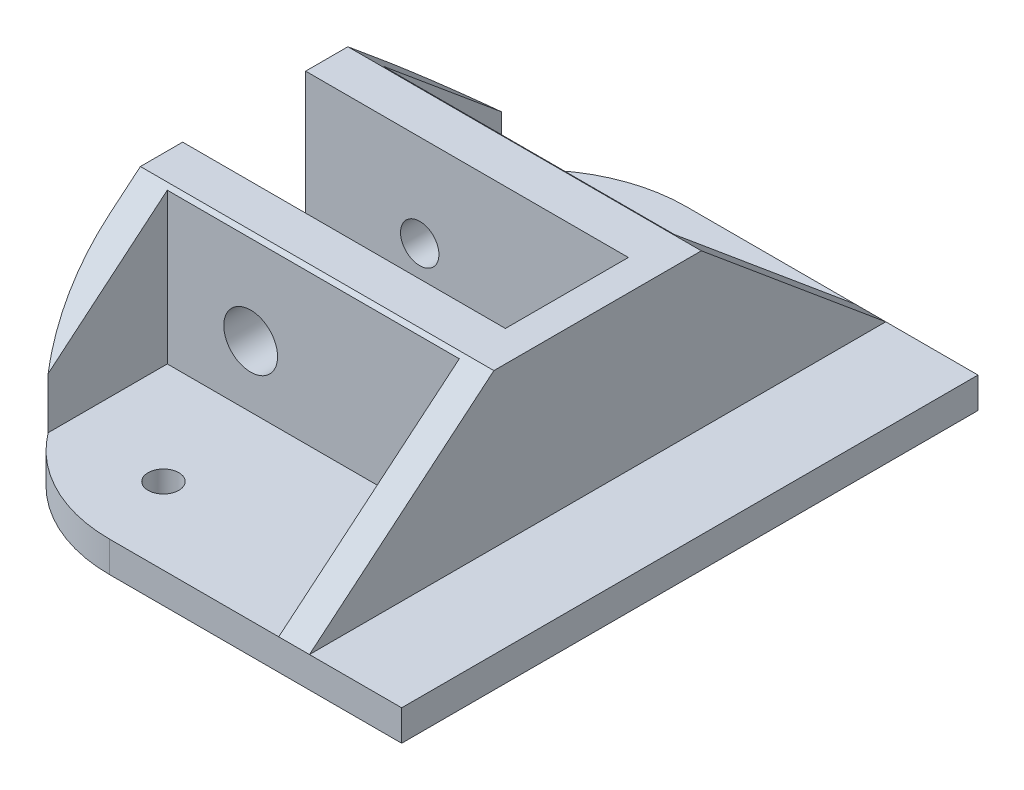
ISO-10303-21;
HEADER;
FILE_DESCRIPTION(('STEP AP214'),'2;1');
FILE_NAME('part.step','',(''),(''),'','','');
FILE_SCHEMA(('AUTOMOTIVE_DESIGN { 1 0 10303 214 1 1 1 1 }'));
ENDSEC;
DATA;
#1=APPLICATION_CONTEXT('core data for automotive mechanical design processes');
#2=APPLICATION_PROTOCOL_DEFINITION('international standard','automotive_design',2000,#1);
#3=PRODUCT_CONTEXT('',#1,'mechanical');
#4=PRODUCT('Part','Part','',(#3));
#5=PRODUCT_RELATED_PRODUCT_CATEGORY('part','',(#4));
#6=PRODUCT_DEFINITION_FORMATION('','',#4);
#7=PRODUCT_DEFINITION_CONTEXT('part definition',#1,'design');
#8=PRODUCT_DEFINITION('design','',#6,#7);
#9=PRODUCT_DEFINITION_SHAPE('','',#8);
#10=(LENGTH_UNIT() NAMED_UNIT(*) SI_UNIT(.MILLI.,.METRE.));
#11=(NAMED_UNIT(*) PLANE_ANGLE_UNIT() SI_UNIT($,.RADIAN.));
#12=(NAMED_UNIT(*) SI_UNIT($,.STERADIAN.) SOLID_ANGLE_UNIT());
#13=UNCERTAINTY_MEASURE_WITH_UNIT(LENGTH_MEASURE(1.E-05),#10,'distance_accuracy_value','');
#14=(GEOMETRIC_REPRESENTATION_CONTEXT(3) GLOBAL_UNCERTAINTY_ASSIGNED_CONTEXT((#13)) GLOBAL_UNIT_ASSIGNED_CONTEXT((#10,
#11,#12)) REPRESENTATION_CONTEXT('',''));
#15=CARTESIAN_POINT('',(0.,0.,0.));
#16=DIRECTION('',(0.,0.,1.));
#17=DIRECTION('',(1.,0.,0.));
#18=AXIS2_PLACEMENT_3D('',#15,#16,#17);
#19=CARTESIAN_POINT('',(0.,2.,0.));
#20=DIRECTION('',(0.,1.,0.));
#21=DIRECTION('',(0.,0.,1.));
#22=AXIS2_PLACEMENT_3D('',#19,#20,#21);
#23=PLANE('',#22);
#24=DIRECTION('',(-1.,0.,0.));
#25=VECTOR('',#24,1.);
#26=CARTESIAN_POINT('',(29.,2.,-37.5));
#27=LINE('',#26,#25);
#28=CARTESIAN_POINT('',(21.,2.,-37.5));
#29=VERTEX_POINT('',#28);
#30=CARTESIAN_POINT('',(10.,2.,-37.5));
#31=VERTEX_POINT('',#30);
#32=EDGE_CURVE('E263',#29,#31,#27,.T.);
#33=ORIENTED_EDGE('',*,*,#32,.T.);
#34=CARTESIAN_POINT('',(10.,2.,-27.5));
#35=DIRECTION('',(0.,1.,0.));
#36=DIRECTION('',(0.,0.,1.));
#37=AXIS2_PLACEMENT_3D('',#34,#35,#36);
#38=CIRCLE('',#37,10.);
#39=CARTESIAN_POINT('',(2.,2.,-33.5));
#40=VERTEX_POINT('',#39);
#41=EDGE_CURVE('E311',#31,#40,#38,.T.);
#42=ORIENTED_EDGE('',*,*,#41,.T.);
#43=DIRECTION('',(0.,0.,-1.));
#44=VECTOR('',#43,1.);
#45=CARTESIAN_POINT('',(2.,2.,-25.75));
#46=LINE('',#45,#44);
#47=CARTESIAN_POINT('',(2.,2.,-25.75));
#48=VERTEX_POINT('',#47);
#49=EDGE_CURVE('E188',#48,#40,#46,.T.);
#50=ORIENTED_EDGE('',*,*,#49,.F.);
#51=DIRECTION('',(-1.,0.,0.));
#52=VECTOR('',#51,1.);
#53=CARTESIAN_POINT('',(21.,2.,-25.75));
#54=LINE('',#53,#52);
#55=CARTESIAN_POINT('',(21.,2.,-25.75));
#56=VERTEX_POINT('',#55);
#57=EDGE_CURVE('E232',#56,#48,#54,.T.);
#58=ORIENTED_EDGE('',*,*,#57,.F.);
#59=DIRECTION('',(0.,0.,1.));
#60=VECTOR('',#59,1.);
#61=CARTESIAN_POINT('',(21.,2.,-37.5));
#62=LINE('',#61,#60);
#63=EDGE_CURVE('E229',#29,#56,#62,.T.);
#64=ORIENTED_EDGE('',*,*,#63,.F.);
#65=EDGE_LOOP('',(#33,#42,#50,#58,#64));
#66=FACE_BOUND('',#65,.T.);
#67=CARTESIAN_POINT('',(8.5,2.,-32.5));
#68=DIRECTION('',(0.,1.,0.));
#69=DIRECTION('',(0.,0.,1.));
#70=AXIS2_PLACEMENT_3D('',#67,#68,#69);
#71=CIRCLE('',#70,1.);
#72=CARTESIAN_POINT('',(8.5,2.,-31.5));
#73=VERTEX_POINT('',#72);
#74=EDGE_CURVE('E251',#73,#73,#71,.T.);
#75=ORIENTED_EDGE('',*,*,#74,.F.);
#76=EDGE_LOOP('',(#75));
#77=FACE_BOUND('',#76,.T.);
#78=ADVANCED_FACE('F38',(#66,#77),#23,.T.);
#79=DIRECTION('',(0.,0.,-1.));
#80=VECTOR('',#79,1.);
#81=CARTESIAN_POINT('',(23.,2.,0.));
#82=LINE('',#81,#80);
#83=CARTESIAN_POINT('',(23.,2.,0.));
#84=VERTEX_POINT('',#83);
#85=CARTESIAN_POINT('',(23.,2.,-37.5));
#86=VERTEX_POINT('',#85);
#87=EDGE_CURVE('E226',#84,#86,#82,.T.);
#88=ORIENTED_EDGE('',*,*,#87,.F.);
#89=DIRECTION('',(1.,0.,0.));
#90=VECTOR('',#89,1.);
#91=CARTESIAN_POINT('',(0.,2.,0.));
#92=LINE('',#91,#90);
#93=CARTESIAN_POINT('',(29.,2.,0.));
#94=VERTEX_POINT('',#93);
#95=EDGE_CURVE('E257',#84,#94,#92,.T.);
#96=ORIENTED_EDGE('',*,*,#95,.T.);
#97=DIRECTION('',(0.,0.,-1.));
#98=VECTOR('',#97,1.);
#99=CARTESIAN_POINT('',(29.,2.,0.));
#100=LINE('',#99,#98);
#101=CARTESIAN_POINT('',(29.,2.,-37.5));
#102=VERTEX_POINT('',#101);
#103=EDGE_CURVE('E261',#94,#102,#100,.T.);
#104=ORIENTED_EDGE('',*,*,#103,.T.);
#105=EDGE_CURVE('E264',#102,#86,#27,.T.);
#106=ORIENTED_EDGE('',*,*,#105,.T.);
#107=EDGE_LOOP('',(#88,#96,#104,#106));
#108=FACE_BOUND('',#107,.T.);
#109=ADVANCED_FACE('F389',(#108),#23,.T.);
#110=DIRECTION('',(0.,0.,-1.));
#111=VECTOR('',#110,1.);
#112=CARTESIAN_POINT('',(2.,2.,0.));
#113=LINE('',#112,#111);
#114=CARTESIAN_POINT('',(2.,2.,-4.));
#115=VERTEX_POINT('',#114);
#116=CARTESIAN_POINT('',(2.,2.,-11.75));
#117=VERTEX_POINT('',#116);
#118=EDGE_CURVE('E216',#115,#117,#113,.T.);
#119=ORIENTED_EDGE('',*,*,#118,.F.);
#120=CARTESIAN_POINT('',(10.,2.,-10.));
#121=DIRECTION('',(0.,1.,0.));
#122=DIRECTION('',(0.,0.,1.));
#123=AXIS2_PLACEMENT_3D('',#120,#121,#122);
#124=CIRCLE('',#123,10.);
#125=CARTESIAN_POINT('',(10.,2.,0.));
#126=VERTEX_POINT('',#125);
#127=EDGE_CURVE('E305',#115,#126,#124,.T.);
#128=ORIENTED_EDGE('',*,*,#127,.T.);
#129=CARTESIAN_POINT('',(21.,2.,0.));
#130=VERTEX_POINT('',#129);
#131=EDGE_CURVE('E259',#126,#130,#92,.T.);
#132=ORIENTED_EDGE('',*,*,#131,.T.);
#133=DIRECTION('',(0.,0.,1.));
#134=VECTOR('',#133,1.);
#135=CARTESIAN_POINT('',(21.,2.,-11.75));
#136=LINE('',#135,#134);
#137=CARTESIAN_POINT('',(21.,2.,-11.75));
#138=VERTEX_POINT('',#137);
#139=EDGE_CURVE('E223',#138,#130,#136,.T.);
#140=ORIENTED_EDGE('',*,*,#139,.F.);
#141=DIRECTION('',(1.,0.,0.));
#142=VECTOR('',#141,1.);
#143=CARTESIAN_POINT('',(2.,2.,-11.75));
#144=LINE('',#143,#142);
#145=EDGE_CURVE('E219',#117,#138,#144,.T.);
#146=ORIENTED_EDGE('',*,*,#145,.F.);
#147=EDGE_LOOP('',(#119,#128,#132,#140,#146));
#148=FACE_BOUND('',#147,.T.);
#149=CARTESIAN_POINT('',(8.5,2.,-5.));
#150=DIRECTION('',(0.,1.,0.));
#151=DIRECTION('',(0.,0.,1.));
#152=AXIS2_PLACEMENT_3D('',#149,#150,#151);
#153=CIRCLE('',#152,1.);
#154=CARTESIAN_POINT('',(8.5,2.,-4.));
#155=VERTEX_POINT('',#154);
#156=EDGE_CURVE('E245',#155,#155,#153,.T.);
#157=ORIENTED_EDGE('',*,*,#156,.F.);
#158=EDGE_LOOP('',(#157));
#159=FACE_BOUND('',#158,.T.);
#160=ADVANCED_FACE('F380',(#148,#159),#23,.T.);
#161=CARTESIAN_POINT('',(0.,0.,0.));
#162=DIRECTION('',(0.,1.,0.));
#163=DIRECTION('',(0.,0.,1.));
#164=AXIS2_PLACEMENT_3D('',#161,#162,#163);
#165=PLANE('',#164);
#166=DIRECTION('',(1.,0.,0.));
#167=VECTOR('',#166,1.);
#168=CARTESIAN_POINT('',(0.,0.,0.));
#169=LINE('',#168,#167);
#170=CARTESIAN_POINT('',(10.,0.,0.));
#171=VERTEX_POINT('',#170);
#172=CARTESIAN_POINT('',(29.,0.,0.));
#173=VERTEX_POINT('',#172);
#174=EDGE_CURVE('E270',#171,#173,#169,.T.);
#175=ORIENTED_EDGE('',*,*,#174,.F.);
#176=CARTESIAN_POINT('',(10.,0.,-10.));
#177=DIRECTION('',(0.,1.,0.));
#178=DIRECTION('',(0.,0.,1.));
#179=AXIS2_PLACEMENT_3D('',#176,#177,#178);
#180=CIRCLE('',#179,10.);
#181=CARTESIAN_POINT('',(0.,0.,-10.));
#182=VERTEX_POINT('',#181);
#183=EDGE_CURVE('E299',#171,#182,#180,.F.);
#184=ORIENTED_EDGE('',*,*,#183,.T.);
#185=DIRECTION('',(0.,0.,1.));
#186=VECTOR('',#185,1.);
#187=CARTESIAN_POINT('',(0.,0.,-14.75));
#188=LINE('',#187,#186);
#189=CARTESIAN_POINT('',(0.,0.,-14.75));
#190=VERTEX_POINT('',#189);
#191=EDGE_CURVE('E254',#190,#182,#188,.T.);
#192=ORIENTED_EDGE('',*,*,#191,.F.);
#193=DIRECTION('',(-1.,0.,0.));
#194=VECTOR('',#193,1.);
#195=CARTESIAN_POINT('',(21.,0.,-14.75));
#196=LINE('',#195,#194);
#197=CARTESIAN_POINT('',(21.,0.,-14.75));
#198=VERTEX_POINT('',#197);
#199=EDGE_CURVE('E260',#198,#190,#196,.T.);
#200=ORIENTED_EDGE('',*,*,#199,.F.);
#201=DIRECTION('',(0.,0.,1.));
#202=VECTOR('',#201,1.);
#203=CARTESIAN_POINT('',(21.,0.,-22.75));
#204=LINE('',#203,#202);
#205=CARTESIAN_POINT('',(21.,0.,-22.75));
#206=VERTEX_POINT('',#205);
#207=EDGE_CURVE('E280',#206,#198,#204,.T.);
#208=ORIENTED_EDGE('',*,*,#207,.F.);
#209=DIRECTION('',(1.,0.,0.));
#210=VECTOR('',#209,1.);
#211=CARTESIAN_POINT('',(0.,0.,-22.75));
#212=LINE('',#211,#210);
#213=CARTESIAN_POINT('',(0.,0.,-22.75));
#214=VERTEX_POINT('',#213);
#215=EDGE_CURVE('E278',#214,#206,#212,.T.);
#216=ORIENTED_EDGE('',*,*,#215,.F.);
#217=DIRECTION('',(0.,0.,1.));
#218=VECTOR('',#217,1.);
#219=CARTESIAN_POINT('',(0.,0.,-37.5));
#220=LINE('',#219,#218);
#221=CARTESIAN_POINT('',(0.,0.,-27.5));
#222=VERTEX_POINT('',#221);
#223=EDGE_CURVE('E194',#222,#214,#220,.T.);
#224=ORIENTED_EDGE('',*,*,#223,.F.);
#225=CARTESIAN_POINT('',(10.,0.,-27.5));
#226=DIRECTION('',(0.,1.,0.));
#227=DIRECTION('',(0.,0.,1.));
#228=AXIS2_PLACEMENT_3D('',#225,#226,#227);
#229=CIRCLE('',#228,10.);
#230=CARTESIAN_POINT('',(10.,0.,-37.5));
#231=VERTEX_POINT('',#230);
#232=EDGE_CURVE('E297',#222,#231,#229,.F.);
#233=ORIENTED_EDGE('',*,*,#232,.T.);
#234=DIRECTION('',(-1.,0.,0.));
#235=VECTOR('',#234,1.);
#236=CARTESIAN_POINT('',(29.,0.,-37.5));
#237=LINE('',#236,#235);
#238=CARTESIAN_POINT('',(29.,0.,-37.5));
#239=VERTEX_POINT('',#238);
#240=EDGE_CURVE('E274',#239,#231,#237,.T.);
#241=ORIENTED_EDGE('',*,*,#240,.F.);
#242=DIRECTION('',(0.,0.,-1.));
#243=VECTOR('',#242,1.);
#244=CARTESIAN_POINT('',(29.,0.,0.));
#245=LINE('',#244,#243);
#246=EDGE_CURVE('E272',#173,#239,#245,.T.);
#247=ORIENTED_EDGE('',*,*,#246,.F.);
#248=EDGE_LOOP('',(#175,#184,#192,#200,#208,#216,#224,#233,#241,#247));
#249=FACE_BOUND('',#248,.T.);
#250=CARTESIAN_POINT('',(8.5,0.,-32.5));
#251=DIRECTION('',(0.,1.,0.));
#252=DIRECTION('',(0.,0.,1.));
#253=AXIS2_PLACEMENT_3D('',#250,#251,#252);
#254=CIRCLE('',#253,1.);
#255=CARTESIAN_POINT('',(8.5,0.,-31.5));
#256=VERTEX_POINT('',#255);
#257=EDGE_CURVE('E248',#256,#256,#254,.T.);
#258=ORIENTED_EDGE('',*,*,#257,.T.);
#259=EDGE_LOOP('',(#258));
#260=FACE_BOUND('',#259,.T.);
#261=CARTESIAN_POINT('',(8.5,0.,-5.));
#262=DIRECTION('',(0.,1.,0.));
#263=DIRECTION('',(0.,0.,1.));
#264=AXIS2_PLACEMENT_3D('',#261,#262,#263);
#265=CIRCLE('',#264,1.);
#266=CARTESIAN_POINT('',(8.5,0.,-4.));
#267=VERTEX_POINT('',#266);
#268=EDGE_CURVE('E244',#267,#267,#265,.T.);
#269=ORIENTED_EDGE('',*,*,#268,.T.);
#270=EDGE_LOOP('',(#269));
#271=FACE_BOUND('',#270,.T.);
#272=ADVANCED_FACE('F364',(#249,#260,#271),#165,.F.);
#273=CARTESIAN_POINT('',(0.,2.,-14.75));
#274=DIRECTION('',(1.,0.,0.));
#275=DIRECTION('',(0.,0.,-1.));
#276=AXIS2_PLACEMENT_3D('',#273,#274,#275);
#277=PLANE('',#276);
#278=DIRECTION('',(0.,-1.,0.));
#279=VECTOR('',#278,1.);
#280=CARTESIAN_POINT('',(0.,2.,-10.));
#281=LINE('',#280,#279);
#282=CARTESIAN_POINT('',(0.,10.3333333333333,-10.));
#283=VERTEX_POINT('',#282);
#284=EDGE_CURVE('E301',#182,#283,#281,.F.);
#285=ORIENTED_EDGE('',*,*,#284,.T.);
#286=DIRECTION('',(0.,0.640184399664479,-0.768221279597376));
#287=VECTOR('',#286,1.);
#288=CARTESIAN_POINT('',(0.,12.,-12.0000000000001));
#289=LINE('',#288,#287);
#290=CARTESIAN_POINT('',(0.,12.,-12.0000000000001));
#291=VERTEX_POINT('',#290);
#292=EDGE_CURVE('E11',#283,#291,#289,.T.);
#293=ORIENTED_EDGE('',*,*,#292,.T.);
#294=DIRECTION('',(0.,0.,1.));
#295=VECTOR('',#294,1.);
#296=CARTESIAN_POINT('',(0.,12.,-14.75));
#297=LINE('',#296,#295);
#298=CARTESIAN_POINT('',(0.,12.,-14.75));
#299=VERTEX_POINT('',#298);
#300=EDGE_CURVE('E210',#299,#291,#297,.T.);
#301=ORIENTED_EDGE('',*,*,#300,.F.);
#302=DIRECTION('',(0.,-1.,0.));
#303=VECTOR('',#302,1.);
#304=CARTESIAN_POINT('',(0.,2.,-14.75));
#305=LINE('',#304,#303);
#306=EDGE_CURVE('E267',#299,#190,#305,.T.);
#307=ORIENTED_EDGE('',*,*,#306,.T.);
#308=ORIENTED_EDGE('',*,*,#191,.T.);
#309=EDGE_LOOP('',(#285,#293,#301,#307,#308));
#310=FACE_BOUND('',#309,.T.);
#311=ADVANCED_FACE('F355',(#310),#277,.F.);
#312=CARTESIAN_POINT('',(0.,2.,0.));
#313=DIRECTION('',(0.,0.,-1.));
#314=DIRECTION('',(-1.,0.,0.));
#315=AXIS2_PLACEMENT_3D('',#312,#313,#314);
#316=PLANE('',#315);
#317=ORIENTED_EDGE('',*,*,#95,.F.);
#318=DIRECTION('',(-1.,0.,0.));
#319=VECTOR('',#318,1.);
#320=CARTESIAN_POINT('',(21.,1.99999999999997,0.));
#321=LINE('',#320,#319);
#322=EDGE_CURVE('E336',#84,#130,#321,.T.);
#323=ORIENTED_EDGE('',*,*,#322,.T.);
#324=ORIENTED_EDGE('',*,*,#131,.F.);
#325=DIRECTION('',(0.,-1.,0.));
#326=VECTOR('',#325,1.);
#327=CARTESIAN_POINT('',(10.,2.,0.));
#328=LINE('',#327,#326);
#329=EDGE_CURVE('E294',#126,#171,#328,.T.);
#330=ORIENTED_EDGE('',*,*,#329,.T.);
#331=ORIENTED_EDGE('',*,*,#174,.T.);
#332=DIRECTION('',(0.,-1.,0.));
#333=VECTOR('',#332,1.);
#334=CARTESIAN_POINT('',(29.,2.,0.));
#335=LINE('',#334,#333);
#336=EDGE_CURVE('E291',#94,#173,#335,.T.);
#337=ORIENTED_EDGE('',*,*,#336,.F.);
#338=EDGE_LOOP('',(#317,#323,#324,#330,#331,#337));
#339=FACE_BOUND('',#338,.T.);
#340=ADVANCED_FACE('F374',(#339),#316,.F.);
#341=CARTESIAN_POINT('',(29.,2.,0.));
#342=DIRECTION('',(-1.,0.,0.));
#343=DIRECTION('',(0.,0.,1.));
#344=AXIS2_PLACEMENT_3D('',#341,#342,#343);
#345=PLANE('',#344);
#346=ORIENTED_EDGE('',*,*,#246,.T.);
#347=DIRECTION('',(0.,-1.,0.));
#348=VECTOR('',#347,1.);
#349=CARTESIAN_POINT('',(29.,2.,-37.5));
#350=LINE('',#349,#348);
#351=EDGE_CURVE('E197',#102,#239,#350,.T.);
#352=ORIENTED_EDGE('',*,*,#351,.F.);
#353=ORIENTED_EDGE('',*,*,#103,.F.);
#354=ORIENTED_EDGE('',*,*,#336,.T.);
#355=EDGE_LOOP('',(#346,#352,#353,#354));
#356=FACE_BOUND('',#355,.T.);
#357=ADVANCED_FACE('F394',(#356),#345,.F.);
#358=CARTESIAN_POINT('',(29.,2.,-37.5));
#359=DIRECTION('',(0.,0.,1.));
#360=DIRECTION('',(1.,0.,0.));
#361=AXIS2_PLACEMENT_3D('',#358,#359,#360);
#362=PLANE('',#361);
#363=ORIENTED_EDGE('',*,*,#32,.F.);
#364=DIRECTION('',(1.,0.,0.));
#365=VECTOR('',#364,1.);
#366=CARTESIAN_POINT('',(23.,1.99999999999998,-37.5));
#367=LINE('',#366,#365);
#368=EDGE_CURVE('E330',#29,#86,#367,.T.);
#369=ORIENTED_EDGE('',*,*,#368,.T.);
#370=ORIENTED_EDGE('',*,*,#105,.F.);
#371=ORIENTED_EDGE('',*,*,#351,.T.);
#372=ORIENTED_EDGE('',*,*,#240,.T.);
#373=DIRECTION('',(0.,-1.,0.));
#374=VECTOR('',#373,1.);
#375=CARTESIAN_POINT('',(10.,2.,-37.5));
#376=LINE('',#375,#374);
#377=EDGE_CURVE('E309',#231,#31,#376,.F.);
#378=ORIENTED_EDGE('',*,*,#377,.T.);
#379=EDGE_LOOP('',(#363,#369,#370,#371,#372,#378));
#380=FACE_BOUND('',#379,.T.);
#381=ADVANCED_FACE('F398',(#380),#362,.F.);
#382=CARTESIAN_POINT('',(0.,2.,-37.5));
#383=DIRECTION('',(1.,0.,0.));
#384=DIRECTION('',(0.,0.,-1.));
#385=AXIS2_PLACEMENT_3D('',#382,#383,#384);
#386=PLANE('',#385);
#387=DIRECTION('',(0.,0.,1.));
#388=VECTOR('',#387,1.);
#389=CARTESIAN_POINT('',(0.,12.,-37.5));
#390=LINE('',#389,#388);
#391=CARTESIAN_POINT('',(0.,12.,-25.5));
#392=VERTEX_POINT('',#391);
#393=CARTESIAN_POINT('',(0.,12.,-22.75));
#394=VERTEX_POINT('',#393);
#395=EDGE_CURVE('E177',#392,#394,#390,.T.);
#396=ORIENTED_EDGE('',*,*,#395,.F.);
#397=DIRECTION('',(0.,-0.640184399664479,-0.768221279597376));
#398=VECTOR('',#397,1.);
#399=CARTESIAN_POINT('',(0.,12.,-25.5));
#400=LINE('',#399,#398);
#401=CARTESIAN_POINT('',(0.,10.3333333333333,-27.5));
#402=VERTEX_POINT('',#401);
#403=EDGE_CURVE('E320',#392,#402,#400,.T.);
#404=ORIENTED_EDGE('',*,*,#403,.T.);
#405=DIRECTION('',(0.,-1.,0.));
#406=VECTOR('',#405,1.);
#407=CARTESIAN_POINT('',(0.,2.,-27.5));
#408=LINE('',#407,#406);
#409=EDGE_CURVE('E307',#402,#222,#408,.T.);
#410=ORIENTED_EDGE('',*,*,#409,.T.);
#411=ORIENTED_EDGE('',*,*,#223,.T.);
#412=DIRECTION('',(0.,-1.,0.));
#413=VECTOR('',#412,1.);
#414=CARTESIAN_POINT('',(0.,2.,-22.75));
#415=LINE('',#414,#413);
#416=EDGE_CURVE('E191',#394,#214,#415,.T.);
#417=ORIENTED_EDGE('',*,*,#416,.F.);
#418=EDGE_LOOP('',(#396,#404,#410,#411,#417));
#419=FACE_BOUND('',#418,.T.);
#420=ADVANCED_FACE('F192',(#419),#386,.F.);
#421=CARTESIAN_POINT('',(0.,2.,-22.75));
#422=DIRECTION('',(0.,0.,-1.));
#423=DIRECTION('',(-1.,0.,0.));
#424=AXIS2_PLACEMENT_3D('',#421,#422,#423);
#425=PLANE('',#424);
#426=CARTESIAN_POINT('',(7.425,6.,-22.75));
#427=DIRECTION('',(0.,0.,-1.));
#428=DIRECTION('',(-1.,0.,0.));
#429=AXIS2_PLACEMENT_3D('',#426,#427,#428);
#430=CIRCLE('',#429,1.25);
#431=CARTESIAN_POINT('',(6.17500000000001,6.,-22.75));
#432=VERTEX_POINT('',#431);
#433=EDGE_CURVE('E755',#432,#432,#430,.F.);
#434=ORIENTED_EDGE('',*,*,#433,.F.);
#435=EDGE_LOOP('',(#434));
#436=FACE_BOUND('',#435,.T.);
#437=ORIENTED_EDGE('',*,*,#215,.T.);
#438=DIRECTION('',(0.,-1.,0.));
#439=VECTOR('',#438,1.);
#440=CARTESIAN_POINT('',(21.,2.,-22.75));
#441=LINE('',#440,#439);
#442=CARTESIAN_POINT('',(21.,12.,-22.75));
#443=VERTEX_POINT('',#442);
#444=EDGE_CURVE('E198',#443,#206,#441,.T.);
#445=ORIENTED_EDGE('',*,*,#444,.F.);
#446=DIRECTION('',(1.,0.,0.));
#447=VECTOR('',#446,1.);
#448=CARTESIAN_POINT('',(0.,12.,-22.75));
#449=LINE('',#448,#447);
#450=EDGE_CURVE('E183',#394,#443,#449,.T.);
#451=ORIENTED_EDGE('',*,*,#450,.F.);
#452=ORIENTED_EDGE('',*,*,#416,.T.);
#453=EDGE_LOOP('',(#437,#445,#451,#452));
#454=FACE_BOUND('',#453,.T.);
#455=ADVANCED_FACE('F200',(#436,#454),#425,.F.);
#456=CARTESIAN_POINT('',(21.,2.,-22.75));
#457=DIRECTION('',(1.,0.,0.));
#458=DIRECTION('',(0.,0.,-1.));
#459=AXIS2_PLACEMENT_3D('',#456,#457,#458);
#460=PLANE('',#459);
#461=ORIENTED_EDGE('',*,*,#207,.T.);
#462=DIRECTION('',(0.,-1.,0.));
#463=VECTOR('',#462,1.);
#464=CARTESIAN_POINT('',(21.,2.,-14.75));
#465=LINE('',#464,#463);
#466=CARTESIAN_POINT('',(21.,12.,-14.75));
#467=VERTEX_POINT('',#466);
#468=EDGE_CURVE('E285',#467,#198,#465,.T.);
#469=ORIENTED_EDGE('',*,*,#468,.F.);
#470=DIRECTION('',(0.,0.,1.));
#471=VECTOR('',#470,1.);
#472=CARTESIAN_POINT('',(21.,12.,-22.75));
#473=LINE('',#472,#471);
#474=EDGE_CURVE('E202',#443,#467,#473,.T.);
#475=ORIENTED_EDGE('',*,*,#474,.F.);
#476=ORIENTED_EDGE('',*,*,#444,.T.);
#477=EDGE_LOOP('',(#461,#469,#475,#476));
#478=FACE_BOUND('',#477,.T.);
#479=ADVANCED_FACE('F415',(#478),#460,.F.);
#480=CARTESIAN_POINT('',(21.,2.,-14.75));
#481=DIRECTION('',(0.,0.,1.));
#482=DIRECTION('',(1.,0.,0.));
#483=AXIS2_PLACEMENT_3D('',#480,#481,#482);
#484=PLANE('',#483);
#485=CARTESIAN_POINT('',(7.42500000000001,6.,-14.75));
#486=DIRECTION('',(0.,0.,1.));
#487=DIRECTION('',(1.,0.,0.));
#488=AXIS2_PLACEMENT_3D('',#485,#486,#487);
#489=CIRCLE('',#488,1.75);
#490=CARTESIAN_POINT('',(9.17500000000001,6.,-14.75));
#491=VERTEX_POINT('',#490);
#492=EDGE_CURVE('E220',#491,#491,#489,.F.);
#493=ORIENTED_EDGE('',*,*,#492,.F.);
#494=EDGE_LOOP('',(#493));
#495=FACE_BOUND('',#494,.T.);
#496=ORIENTED_EDGE('',*,*,#199,.T.);
#497=ORIENTED_EDGE('',*,*,#306,.F.);
#498=DIRECTION('',(-1.,0.,0.));
#499=VECTOR('',#498,1.);
#500=CARTESIAN_POINT('',(21.,12.,-14.75));
#501=LINE('',#500,#499);
#502=EDGE_CURVE('E204',#467,#299,#501,.T.);
#503=ORIENTED_EDGE('',*,*,#502,.F.);
#504=ORIENTED_EDGE('',*,*,#468,.T.);
#505=EDGE_LOOP('',(#496,#497,#503,#504));
#506=FACE_BOUND('',#505,.T.);
#507=ADVANCED_FACE('F359',(#495,#506),#484,.F.);
#508=CARTESIAN_POINT('',(8.5,2.,-32.5));
#509=DIRECTION('',(0.,-1.,0.));
#510=DIRECTION('',(0.,0.,-1.));
#511=AXIS2_PLACEMENT_3D('',#508,#509,#510);
#512=CYLINDRICAL_SURFACE('',#511,1.);
#513=ORIENTED_EDGE('',*,*,#74,.T.);
#514=EDGE_LOOP('',(#513));
#515=FACE_BOUND('',#514,.T.);
#516=ORIENTED_EDGE('',*,*,#257,.F.);
#517=EDGE_LOOP('',(#516));
#518=FACE_BOUND('',#517,.T.);
#519=ADVANCED_FACE('F422',(#515,#518),#512,.F.);
#520=CARTESIAN_POINT('',(8.5,2.,-5.));
#521=DIRECTION('',(0.,-1.,0.));
#522=DIRECTION('',(0.,0.,-1.));
#523=AXIS2_PLACEMENT_3D('',#520,#521,#522);
#524=CYLINDRICAL_SURFACE('',#523,1.);
#525=ORIENTED_EDGE('',*,*,#156,.T.);
#526=EDGE_LOOP('',(#525));
#527=FACE_BOUND('',#526,.T.);
#528=ORIENTED_EDGE('',*,*,#268,.F.);
#529=EDGE_LOOP('',(#528));
#530=FACE_BOUND('',#529,.T.);
#531=ADVANCED_FACE('F567',(#527,#530),#524,.F.);
#532=CARTESIAN_POINT('',(2.,12.,0.));
#533=DIRECTION('',(-1.,0.,0.));
#534=DIRECTION('',(0.,0.,1.));
#535=AXIS2_PLACEMENT_3D('',#532,#533,#534);
#536=PLANE('',#535);
#537=DIRECTION('',(0.,-1.,0.));
#538=VECTOR('',#537,1.);
#539=CARTESIAN_POINT('',(2.,12.,-11.75));
#540=LINE('',#539,#538);
#541=CARTESIAN_POINT('',(2.,11.7916666666666,-11.75));
#542=VERTEX_POINT('',#541);
#543=EDGE_CURVE('E242',#542,#117,#540,.T.);
#544=ORIENTED_EDGE('',*,*,#543,.F.);
#545=DIRECTION('',(0.,-0.640184399664479,0.768221279597376));
#546=VECTOR('',#545,1.);
#547=CARTESIAN_POINT('',(2.,12.,-12.0000000000001));
#548=LINE('',#547,#546);
#549=CARTESIAN_POINT('',(2.,5.3333333333333,-4.));
#550=VERTEX_POINT('',#549);
#551=EDGE_CURVE('E61',#542,#550,#548,.T.);
#552=ORIENTED_EDGE('',*,*,#551,.T.);
#553=DIRECTION('',(0.,-1.,0.));
#554=VECTOR('',#553,1.);
#555=CARTESIAN_POINT('',(2.,12.,-4.));
#556=LINE('',#555,#554);
#557=EDGE_CURVE('E303',#550,#115,#556,.T.);
#558=ORIENTED_EDGE('',*,*,#557,.T.);
#559=ORIENTED_EDGE('',*,*,#118,.T.);
#560=EDGE_LOOP('',(#544,#552,#558,#559));
#561=FACE_BOUND('',#560,.T.);
#562=ADVANCED_FACE('F348',(#561),#536,.F.);
#563=CARTESIAN_POINT('',(2.,12.,-11.75));
#564=DIRECTION('',(0.,0.,-1.));
#565=DIRECTION('',(-1.,0.,0.));
#566=AXIS2_PLACEMENT_3D('',#563,#564,#565);
#567=PLANE('',#566);
#568=CARTESIAN_POINT('',(7.42500000000001,6.,-11.75));
#569=DIRECTION('',(0.,0.,1.));
#570=DIRECTION('',(1.,0.,0.));
#571=AXIS2_PLACEMENT_3D('',#568,#569,#570);
#572=CIRCLE('',#571,1.75);
#573=CARTESIAN_POINT('',(9.17500000000001,6.,-11.75));
#574=VERTEX_POINT('',#573);
#575=EDGE_CURVE('E751',#574,#574,#572,.T.);
#576=ORIENTED_EDGE('',*,*,#575,.F.);
#577=EDGE_LOOP('',(#576));
#578=FACE_BOUND('',#577,.T.);
#579=DIRECTION('',(0.,-1.,0.));
#580=VECTOR('',#579,1.);
#581=CARTESIAN_POINT('',(21.,12.,-11.75));
#582=LINE('',#581,#580);
#583=CARTESIAN_POINT('',(21.,11.7916666666666,-11.75));
#584=VERTEX_POINT('',#583);
#585=EDGE_CURVE('E240',#584,#138,#582,.T.);
#586=ORIENTED_EDGE('',*,*,#585,.F.);
#587=DIRECTION('',(-1.,0.,0.));
#588=VECTOR('',#587,1.);
#589=CARTESIAN_POINT('',(0.,11.7916666666666,-11.75));
#590=LINE('',#589,#588);
#591=EDGE_CURVE('E340',#584,#542,#590,.T.);
#592=ORIENTED_EDGE('',*,*,#591,.T.);
#593=ORIENTED_EDGE('',*,*,#543,.T.);
#594=ORIENTED_EDGE('',*,*,#145,.T.);
#595=EDGE_LOOP('',(#586,#592,#593,#594));
#596=FACE_BOUND('',#595,.T.);
#597=ADVANCED_FACE('F345',(#578,#596),#567,.F.);
#598=CARTESIAN_POINT('',(21.,12.,-11.75));
#599=DIRECTION('',(1.,0.,0.));
#600=DIRECTION('',(0.,0.,-1.));
#601=AXIS2_PLACEMENT_3D('',#598,#599,#600);
#602=PLANE('',#601);
#603=ORIENTED_EDGE('',*,*,#139,.T.);
#604=DIRECTION('',(0.,0.640184399664479,-0.768221279597376));
#605=VECTOR('',#604,1.);
#606=CARTESIAN_POINT('',(21.,12.,-12.));
#607=LINE('',#606,#605);
#608=EDGE_CURVE('E338',#130,#584,#607,.T.);
#609=ORIENTED_EDGE('',*,*,#608,.T.);
#610=ORIENTED_EDGE('',*,*,#585,.T.);
#611=EDGE_LOOP('',(#603,#609,#610));
#612=FACE_BOUND('',#611,.T.);
#613=ADVANCED_FACE('F383',(#612),#602,.F.);
#614=CARTESIAN_POINT('',(23.,12.,0.));
#615=DIRECTION('',(-1.,0.,0.));
#616=DIRECTION('',(0.,0.,1.));
#617=AXIS2_PLACEMENT_3D('',#614,#615,#616);
#618=PLANE('',#617);
#619=ORIENTED_EDGE('',*,*,#87,.T.);
#620=DIRECTION('',(0.,0.640184399664479,0.768221279597376));
#621=VECTOR('',#620,1.);
#622=CARTESIAN_POINT('',(23.,12.,-25.5));
#623=LINE('',#622,#621);
#624=CARTESIAN_POINT('',(23.,12.,-25.5));
#625=VERTEX_POINT('',#624);
#626=EDGE_CURVE('E334',#86,#625,#623,.T.);
#627=ORIENTED_EDGE('',*,*,#626,.T.);
#628=DIRECTION('',(0.,0.,-1.));
#629=VECTOR('',#628,1.);
#630=CARTESIAN_POINT('',(23.,12.,0.));
#631=LINE('',#630,#629);
#632=CARTESIAN_POINT('',(23.,12.,-12.0000000000001));
#633=VERTEX_POINT('',#632);
#634=EDGE_CURVE('E213',#633,#625,#631,.T.);
#635=ORIENTED_EDGE('',*,*,#634,.F.);
#636=DIRECTION('',(0.,-0.640184399664479,0.768221279597376));
#637=VECTOR('',#636,1.);
#638=CARTESIAN_POINT('',(23.,12.,-12.0000000000001));
#639=LINE('',#638,#637);
#640=EDGE_CURVE('E332',#633,#84,#639,.T.);
#641=ORIENTED_EDGE('',*,*,#640,.T.);
#642=EDGE_LOOP('',(#619,#627,#635,#641));
#643=FACE_BOUND('',#642,.T.);
#644=ADVANCED_FACE('F386',(#643),#618,.F.);
#645=CARTESIAN_POINT('',(21.,12.,-37.5));
#646=DIRECTION('',(1.,0.,0.));
#647=DIRECTION('',(0.,0.,-1.));
#648=AXIS2_PLACEMENT_3D('',#645,#646,#647);
#649=PLANE('',#648);
#650=DIRECTION('',(0.,-1.,0.));
#651=VECTOR('',#650,1.);
#652=CARTESIAN_POINT('',(21.,12.,-25.75));
#653=LINE('',#652,#651);
#654=CARTESIAN_POINT('',(21.,11.7916666666666,-25.75));
#655=VERTEX_POINT('',#654);
#656=EDGE_CURVE('E238',#655,#56,#653,.T.);
#657=ORIENTED_EDGE('',*,*,#656,.F.);
#658=DIRECTION('',(0.,-0.640184399664479,-0.768221279597376));
#659=VECTOR('',#658,1.);
#660=CARTESIAN_POINT('',(21.,12.,-25.5));
#661=LINE('',#660,#659);
#662=EDGE_CURVE('E328',#655,#29,#661,.T.);
#663=ORIENTED_EDGE('',*,*,#662,.T.);
#664=ORIENTED_EDGE('',*,*,#63,.T.);
#665=EDGE_LOOP('',(#657,#663,#664));
#666=FACE_BOUND('',#665,.T.);
#667=ADVANCED_FACE('F518',(#666),#649,.F.);
#668=CARTESIAN_POINT('',(21.,12.,-25.75));
#669=DIRECTION('',(0.,0.,1.));
#670=DIRECTION('',(1.,0.,0.));
#671=AXIS2_PLACEMENT_3D('',#668,#669,#670);
#672=PLANE('',#671);
#673=CARTESIAN_POINT('',(7.425,6.,-25.75));
#674=DIRECTION('',(0.,0.,-1.));
#675=DIRECTION('',(-1.,0.,0.));
#676=AXIS2_PLACEMENT_3D('',#673,#674,#675);
#677=CIRCLE('',#676,1.25);
#678=CARTESIAN_POINT('',(6.17500000000001,6.,-25.75));
#679=VERTEX_POINT('',#678);
#680=EDGE_CURVE('E759',#679,#679,#677,.T.);
#681=ORIENTED_EDGE('',*,*,#680,.F.);
#682=EDGE_LOOP('',(#681));
#683=FACE_BOUND('',#682,.T.);
#684=DIRECTION('',(0.,-1.,0.));
#685=VECTOR('',#684,1.);
#686=CARTESIAN_POINT('',(2.,12.,-25.75));
#687=LINE('',#686,#685);
#688=CARTESIAN_POINT('',(2.,11.7916666666666,-25.75));
#689=VERTEX_POINT('',#688);
#690=EDGE_CURVE('E215',#689,#48,#687,.T.);
#691=ORIENTED_EDGE('',*,*,#690,.F.);
#692=DIRECTION('',(1.,0.,0.));
#693=VECTOR('',#692,1.);
#694=CARTESIAN_POINT('',(0.,11.7916666666666,-25.75));
#695=LINE('',#694,#693);
#696=EDGE_CURVE('E326',#689,#655,#695,.T.);
#697=ORIENTED_EDGE('',*,*,#696,.T.);
#698=ORIENTED_EDGE('',*,*,#656,.T.);
#699=ORIENTED_EDGE('',*,*,#57,.T.);
#700=EDGE_LOOP('',(#691,#697,#698,#699));
#701=FACE_BOUND('',#700,.T.);
#702=ADVANCED_FACE('F507',(#683,#701),#672,.F.);
#703=CARTESIAN_POINT('',(2.,12.,-25.75));
#704=DIRECTION('',(-1.,0.,0.));
#705=DIRECTION('',(0.,0.,1.));
#706=AXIS2_PLACEMENT_3D('',#703,#704,#705);
#707=PLANE('',#706);
#708=DIRECTION('',(0.,-1.,0.));
#709=VECTOR('',#708,1.);
#710=CARTESIAN_POINT('',(2.,2.,-33.5));
#711=LINE('',#710,#709);
#712=CARTESIAN_POINT('',(2.,5.33333333333331,-33.5));
#713=VERTEX_POINT('',#712);
#714=EDGE_CURVE('E313',#40,#713,#711,.F.);
#715=ORIENTED_EDGE('',*,*,#714,.T.);
#716=DIRECTION('',(0.,0.640184399664479,0.768221279597376));
#717=VECTOR('',#716,1.);
#718=CARTESIAN_POINT('',(2.,12.,-25.5));
#719=LINE('',#718,#717);
#720=EDGE_CURVE('E324',#713,#689,#719,.T.);
#721=ORIENTED_EDGE('',*,*,#720,.T.);
#722=ORIENTED_EDGE('',*,*,#690,.T.);
#723=ORIENTED_EDGE('',*,*,#49,.T.);
#724=EDGE_LOOP('',(#715,#721,#722,#723));
#725=FACE_BOUND('',#724,.T.);
#726=ADVANCED_FACE('F495',(#725),#707,.F.);
#727=CARTESIAN_POINT('',(0.,12.,0.));
#728=DIRECTION('',(0.,1.,0.));
#729=DIRECTION('',(0.,0.,1.));
#730=AXIS2_PLACEMENT_3D('',#727,#728,#729);
#731=PLANE('',#730);
#732=ORIENTED_EDGE('',*,*,#634,.T.);
#733=DIRECTION('',(-1.,0.,0.));
#734=VECTOR('',#733,1.);
#735=CARTESIAN_POINT('',(21.,12.,-25.5));
#736=LINE('',#735,#734);
#737=EDGE_CURVE('E186',#625,#392,#736,.T.);
#738=ORIENTED_EDGE('',*,*,#737,.T.);
#739=ORIENTED_EDGE('',*,*,#395,.T.);
#740=ORIENTED_EDGE('',*,*,#450,.T.);
#741=ORIENTED_EDGE('',*,*,#474,.T.);
#742=ORIENTED_EDGE('',*,*,#502,.T.);
#743=ORIENTED_EDGE('',*,*,#300,.T.);
#744=DIRECTION('',(1.,0.,0.));
#745=VECTOR('',#744,1.);
#746=CARTESIAN_POINT('',(23.,12.,-12.0000000000001));
#747=LINE('',#746,#745);
#748=EDGE_CURVE('E316',#291,#633,#747,.T.);
#749=ORIENTED_EDGE('',*,*,#748,.T.);
#750=EDGE_LOOP('',(#732,#738,#739,#740,#741,#742,#743,#749));
#751=FACE_BOUND('',#750,.T.);
#752=ADVANCED_FACE('F180',(#751),#731,.T.);
#753=CARTESIAN_POINT('',(7.42500000000001,6.,-37.501));
#754=DIRECTION('',(0.,0.,1.));
#755=DIRECTION('',(1.,0.,0.));
#756=AXIS2_PLACEMENT_3D('',#753,#754,#755);
#757=CYLINDRICAL_SURFACE('',#756,1.75);
#758=ORIENTED_EDGE('',*,*,#575,.T.);
#759=EDGE_LOOP('',(#758));
#760=FACE_BOUND('',#759,.T.);
#761=ORIENTED_EDGE('',*,*,#492,.T.);
#762=EDGE_LOOP('',(#761));
#763=FACE_BOUND('',#762,.T.);
#764=ADVANCED_FACE('F494',(#760,#763),#757,.F.);
#765=CARTESIAN_POINT('',(7.42500000000001,6.,0.00100000000000447));
#766=DIRECTION('',(0.,0.,-1.));
#767=DIRECTION('',(-1.,0.,0.));
#768=AXIS2_PLACEMENT_3D('',#765,#766,#767);
#769=CYLINDRICAL_SURFACE('',#768,1.25);
#770=CARTESIAN_POINT('',(6.17500000000001,6.,-25.75));
#771=CARTESIAN_POINT('',(6.17500000000001,6.,-25.71875));
#772=CARTESIAN_POINT('',(6.17500000000001,6.,-25.6875));
#773=CARTESIAN_POINT('',(6.17500000000001,6.,-25.625));
#774=CARTESIAN_POINT('',(6.17500000000001,6.,-25.59375));
#775=CARTESIAN_POINT('',(6.17500000000001,6.,-25.53125));
#776=CARTESIAN_POINT('',(6.17500000000001,6.,-25.5));
#777=CARTESIAN_POINT('',(6.17500000000001,6.,-25.4375));
#778=CARTESIAN_POINT('',(6.17500000000001,6.,-25.40625));
#779=CARTESIAN_POINT('',(6.17500000000001,6.,-25.34375));
#780=CARTESIAN_POINT('',(6.17500000000001,6.,-25.3125));
#781=CARTESIAN_POINT('',(6.17500000000001,6.,-25.25));
#782=CARTESIAN_POINT('',(6.17500000000001,6.,-25.21875));
#783=CARTESIAN_POINT('',(6.17500000000001,6.,-25.15625));
#784=CARTESIAN_POINT('',(6.17500000000001,6.,-25.125));
#785=CARTESIAN_POINT('',(6.17500000000001,6.,-25.0625));
#786=CARTESIAN_POINT('',(6.17500000000001,6.,-25.03125));
#787=CARTESIAN_POINT('',(6.17500000000001,6.,-24.96875));
#788=CARTESIAN_POINT('',(6.17500000000001,6.,-24.9375));
#789=CARTESIAN_POINT('',(6.17500000000001,6.,-24.875));
#790=CARTESIAN_POINT('',(6.17500000000001,6.,-24.84375));
#791=CARTESIAN_POINT('',(6.17500000000001,6.,-24.78125));
#792=CARTESIAN_POINT('',(6.17500000000001,6.,-24.75));
#793=CARTESIAN_POINT('',(6.17500000000001,6.,-24.6875));
#794=CARTESIAN_POINT('',(6.17500000000001,6.,-24.65625));
#795=CARTESIAN_POINT('',(6.17500000000001,6.,-24.59375));
#796=CARTESIAN_POINT('',(6.17500000000001,6.,-24.5625));
#797=CARTESIAN_POINT('',(6.17500000000001,6.,-24.5));
#798=CARTESIAN_POINT('',(6.17500000000001,6.,-24.46875));
#799=CARTESIAN_POINT('',(6.17500000000001,6.,-24.40625));
#800=CARTESIAN_POINT('',(6.17500000000001,6.,-24.375));
#801=CARTESIAN_POINT('',(6.17500000000001,6.,-24.3125));
#802=CARTESIAN_POINT('',(6.17500000000001,6.,-24.28125));
#803=CARTESIAN_POINT('',(6.17500000000001,6.,-24.21875));
#804=CARTESIAN_POINT('',(6.17500000000001,6.,-24.1875));
#805=CARTESIAN_POINT('',(6.17500000000001,6.,-24.125));
#806=CARTESIAN_POINT('',(6.17500000000001,6.,-24.09375));
#807=CARTESIAN_POINT('',(6.17500000000001,6.,-24.03125));
#808=CARTESIAN_POINT('',(6.17500000000001,6.,-24.));
#809=CARTESIAN_POINT('',(6.17500000000001,6.,-23.9375));
#810=CARTESIAN_POINT('',(6.17500000000001,6.,-23.90625));
#811=CARTESIAN_POINT('',(6.17500000000001,6.,-23.84375));
#812=CARTESIAN_POINT('',(6.17500000000001,6.,-23.8125));
#813=CARTESIAN_POINT('',(6.17500000000001,6.,-23.75));
#814=CARTESIAN_POINT('',(6.17500000000001,6.,-23.71875));
#815=CARTESIAN_POINT('',(6.17500000000001,6.,-23.65625));
#816=CARTESIAN_POINT('',(6.17500000000001,6.,-23.625));
#817=CARTESIAN_POINT('',(6.17500000000001,6.,-23.5625));
#818=CARTESIAN_POINT('',(6.17500000000001,6.,-23.53125));
#819=CARTESIAN_POINT('',(6.17500000000001,6.,-23.46875));
#820=CARTESIAN_POINT('',(6.17500000000001,6.,-23.4375));
#821=CARTESIAN_POINT('',(6.17500000000001,6.,-23.375));
#822=CARTESIAN_POINT('',(6.17500000000001,6.,-23.34375));
#823=CARTESIAN_POINT('',(6.17500000000001,6.,-23.28125));
#824=CARTESIAN_POINT('',(6.17500000000001,6.,-23.25));
#825=CARTESIAN_POINT('',(6.17500000000001,6.,-23.1875));
#826=CARTESIAN_POINT('',(6.17500000000001,6.,-23.15625));
#827=CARTESIAN_POINT('',(6.17500000000001,6.,-23.09375));
#828=CARTESIAN_POINT('',(6.17500000000001,6.,-23.0625));
#829=CARTESIAN_POINT('',(6.17500000000001,6.,-23.));
#830=CARTESIAN_POINT('',(6.17500000000001,6.,-22.96875));
#831=CARTESIAN_POINT('',(6.17500000000001,6.,-22.90625));
#832=CARTESIAN_POINT('',(6.17500000000001,6.,-22.875));
#833=CARTESIAN_POINT('',(6.17500000000001,6.,-22.8125));
#834=CARTESIAN_POINT('',(6.17500000000001,6.,-22.78125));
#835=CARTESIAN_POINT('',(6.17500000000001,6.,-22.75));
#836=B_SPLINE_CURVE_WITH_KNOTS('',3,(#770,#771,#772,#773,#774,#775,#776,#777,#778,#779,#780,
#781,#782,#783,#784,#785,#786,#787,#788,#789,#790,#791,#792,#793,#794,#795,#796,#797,#798,#799,
#800,#801,#802,#803,#804,#805,#806,#807,#808,#809,#810,#811,#812,#813,#814,#815,#816,#817,#818,
#819,#820,#821,#822,#823,#824,#825,#826,#827,#828,#829,#830,#831,#832,#833,#834,#835),
.UNSPECIFIED.,.F.,.F.,(4,2,2,2,2,2,2,2,2,2,2,2,2,2,2,2,2,2,2,2,2,2,2,2,2,2,2,2,2,2,2,2,4),(0.,
0.0937500000000001,0.1875,0.28125,0.375,0.46875,0.5625,0.656250000000001,0.750000000000001,
0.843749999999997,0.937499999999997,1.03125,1.125,1.21875,1.3125,1.40625,1.5,1.59375,1.6875,
1.78125,1.875,1.96875,2.0625,2.15625,2.25,2.34375,2.4375,2.53125,2.625,2.71875,2.8125,2.90625,
3.),.UNSPECIFIED.);
#837=EDGE_CURVE('BSEAM452',#679,#432,#836,.T.);
#838=ORIENTED_EDGE('',*,*,#680,.T.);
#839=ORIENTED_EDGE('',*,*,#433,.T.);
#840=ORIENTED_EDGE('',*,*,#837,.T.);
#841=ORIENTED_EDGE('',*,*,#837,.F.);
#842=EDGE_LOOP('',(#838,#840,#839,#841));
#843=FACE_BOUND('',#842,.T.);
#844=ADVANCED_FACE('F452',(#843),#769,.F.);
#845=CARTESIAN_POINT('',(10.,2.,-10.));
#846=DIRECTION('',(0.,-1.,0.));
#847=DIRECTION('',(0.,0.,-1.));
#848=AXIS2_PLACEMENT_3D('',#845,#846,#847);
#849=CYLINDRICAL_SURFACE('',#848,10.);
#850=ORIENTED_EDGE('',*,*,#557,.F.);
#851=CARTESIAN_POINT('',(10.,10.3333333333333,-10.));
#852=DIRECTION('',(0.,0.768221279597376,0.640184399664479));
#853=DIRECTION('',(0.,-0.640184399664479,0.768221279597376));
#854=AXIS2_PLACEMENT_3D('',#851,#852,#853);
#855=ELLIPSE('',#854,13.0170827931777,10.);
#856=EDGE_CURVE('E47',#550,#283,#855,.F.);
#857=ORIENTED_EDGE('',*,*,#856,.T.);
#858=ORIENTED_EDGE('',*,*,#284,.F.);
#859=ORIENTED_EDGE('',*,*,#183,.F.);
#860=ORIENTED_EDGE('',*,*,#329,.F.);
#861=ORIENTED_EDGE('',*,*,#127,.F.);
#862=EDGE_LOOP('',(#850,#857,#858,#859,#860,#861));
#863=FACE_BOUND('',#862,.T.);
#864=ADVANCED_FACE('F369',(#863),#849,.T.);
#865=CARTESIAN_POINT('',(10.,2.,-27.5));
#866=DIRECTION('',(0.,-1.,0.));
#867=DIRECTION('',(0.,0.,-1.));
#868=AXIS2_PLACEMENT_3D('',#865,#866,#867);
#869=CYLINDRICAL_SURFACE('',#868,10.);
#870=ORIENTED_EDGE('',*,*,#409,.F.);
#871=CARTESIAN_POINT('',(10.,10.3333333333333,-27.5));
#872=DIRECTION('',(0.,0.768221279597376,-0.640184399664479));
#873=DIRECTION('',(0.,-0.640184399664479,-0.768221279597376));
#874=AXIS2_PLACEMENT_3D('',#871,#872,#873);
#875=ELLIPSE('',#874,13.0170827931777,10.);
#876=EDGE_CURVE('E322',#402,#713,#875,.F.);
#877=ORIENTED_EDGE('',*,*,#876,.T.);
#878=ORIENTED_EDGE('',*,*,#714,.F.);
#879=ORIENTED_EDGE('',*,*,#41,.F.);
#880=ORIENTED_EDGE('',*,*,#377,.F.);
#881=ORIENTED_EDGE('',*,*,#232,.F.);
#882=EDGE_LOOP('',(#870,#877,#878,#879,#880,#881));
#883=FACE_BOUND('',#882,.T.);
#884=ADVANCED_FACE('F410',(#883),#869,.T.);
#885=CARTESIAN_POINT('',(0.,12.,-25.5));
#886=DIRECTION('',(0.,0.768221279597376,-0.640184399664479));
#887=DIRECTION('',(1.,0.,0.));
#888=AXIS2_PLACEMENT_3D('',#885,#886,#887);
#889=PLANE('',#888);
#890=ORIENTED_EDGE('',*,*,#626,.F.);
#891=ORIENTED_EDGE('',*,*,#368,.F.);
#892=ORIENTED_EDGE('',*,*,#662,.F.);
#893=ORIENTED_EDGE('',*,*,#696,.F.);
#894=ORIENTED_EDGE('',*,*,#720,.F.);
#895=ORIENTED_EDGE('',*,*,#876,.F.);
#896=ORIENTED_EDGE('',*,*,#403,.F.);
#897=ORIENTED_EDGE('',*,*,#737,.F.);
#898=EDGE_LOOP('',(#890,#891,#892,#893,#894,#895,#896,#897));
#899=FACE_BOUND('',#898,.T.);
#900=ADVANCED_FACE('F403',(#899),#889,.T.);
#901=CARTESIAN_POINT('',(0.,12.,-12.0000000000001));
#902=DIRECTION('',(0.,0.768221279597376,0.640184399664479));
#903=DIRECTION('',(-1.,0.,0.));
#904=AXIS2_PLACEMENT_3D('',#901,#902,#903);
#905=PLANE('',#904);
#906=ORIENTED_EDGE('',*,*,#608,.F.);
#907=ORIENTED_EDGE('',*,*,#322,.F.);
#908=ORIENTED_EDGE('',*,*,#640,.F.);
#909=ORIENTED_EDGE('',*,*,#748,.F.);
#910=ORIENTED_EDGE('',*,*,#292,.F.);
#911=ORIENTED_EDGE('',*,*,#856,.F.);
#912=ORIENTED_EDGE('',*,*,#551,.F.);
#913=ORIENTED_EDGE('',*,*,#591,.F.);
#914=EDGE_LOOP('',(#906,#907,#908,#909,#910,#911,#912,#913));
#915=FACE_BOUND('',#914,.T.);
#916=ADVANCED_FACE('F41',(#915),#905,.T.);
#917=CLOSED_SHELL('',(#78,#109,#160,#272,#311,#340,#357,#381,#420,#455,#479,#507,#519,#531,#562,
#597,#613,#644,#667,#702,#726,#752,#764,#844,#864,#884,#900,#916));
#918=MANIFOLD_SOLID_BREP('B2',#917);
#919=ADVANCED_BREP_SHAPE_REPRESENTATION('',(#18,#918),#14);
#920=SHAPE_DEFINITION_REPRESENTATION(#9,#919);
ENDSEC;
END-ISO-10303-21;
